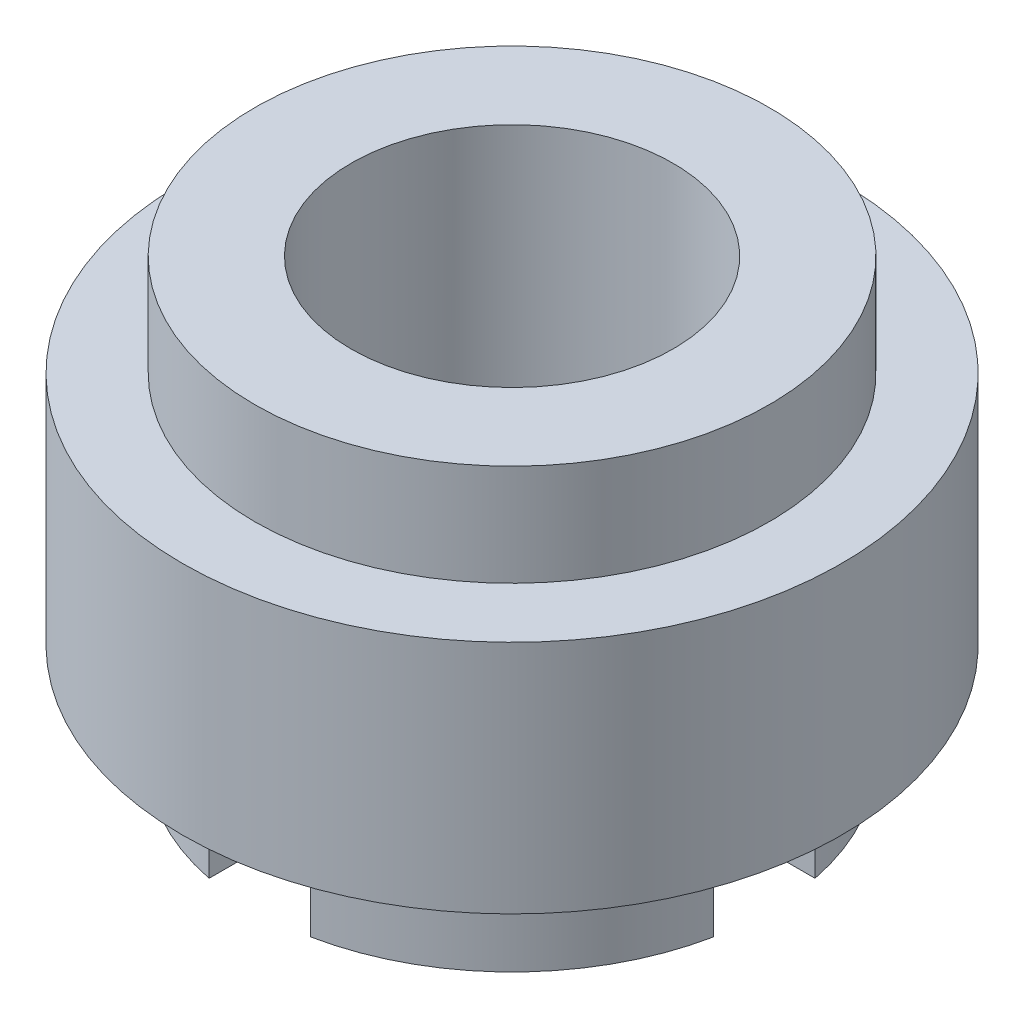
ISO-10303-21;
HEADER;
FILE_DESCRIPTION(('STEP AP214'),'2;1');
FILE_NAME('part.step','',(''),(''),'','','');
FILE_SCHEMA(('AUTOMOTIVE_DESIGN { 1 0 10303 214 1 1 1 1 }'));
ENDSEC;
DATA;
#1=APPLICATION_CONTEXT('core data for automotive mechanical design processes');
#2=APPLICATION_PROTOCOL_DEFINITION('international standard','automotive_design',2000,#1);
#3=PRODUCT_CONTEXT('',#1,'mechanical');
#4=PRODUCT('Part','Part','',(#3));
#5=PRODUCT_RELATED_PRODUCT_CATEGORY('part','',(#4));
#6=PRODUCT_DEFINITION_FORMATION('','',#4);
#7=PRODUCT_DEFINITION_CONTEXT('part definition',#1,'design');
#8=PRODUCT_DEFINITION('design','',#6,#7);
#9=PRODUCT_DEFINITION_SHAPE('','',#8);
#10=(LENGTH_UNIT() NAMED_UNIT(*) SI_UNIT(.MILLI.,.METRE.));
#11=(NAMED_UNIT(*) PLANE_ANGLE_UNIT() SI_UNIT($,.RADIAN.));
#12=(NAMED_UNIT(*) SI_UNIT($,.STERADIAN.) SOLID_ANGLE_UNIT());
#13=UNCERTAINTY_MEASURE_WITH_UNIT(LENGTH_MEASURE(1.E-05),#10,'distance_accuracy_value','');
#14=(GEOMETRIC_REPRESENTATION_CONTEXT(3) GLOBAL_UNCERTAINTY_ASSIGNED_CONTEXT((#13)) GLOBAL_UNIT_ASSIGNED_CONTEXT((#10,
#11,#12)) REPRESENTATION_CONTEXT('',''));
#15=CARTESIAN_POINT('',(0.,0.,0.));
#16=DIRECTION('',(0.,0.,1.));
#17=DIRECTION('',(1.,0.,0.));
#18=AXIS2_PLACEMENT_3D('',#15,#16,#17);
#19=CARTESIAN_POINT('',(0.,-2.,0.));
#20=DIRECTION('',(0.,1.,0.));
#21=DIRECTION('',(0.,0.,1.));
#22=AXIS2_PLACEMENT_3D('',#19,#20,#21);
#23=CYLINDRICAL_SURFACE('',#22,5.075);
#24=DIRECTION('',(0.,1.,0.));
#25=VECTOR('',#24,1.);
#26=CARTESIAN_POINT('',(-4.9755024871866,-2.,-1.));
#27=LINE('',#26,#25);
#28=CARTESIAN_POINT('',(-4.9755024871866,0.,-1.));
#29=VERTEX_POINT('',#28);
#30=CARTESIAN_POINT('',(-4.9755024871866,-2.,-1.));
#31=VERTEX_POINT('',#30);
#32=EDGE_CURVE('E217',#29,#31,#27,.F.);
#33=ORIENTED_EDGE('',*,*,#32,.F.);
#34=CARTESIAN_POINT('',(0.,0.,0.));
#35=DIRECTION('',(0.,1.,0.));
#36=DIRECTION('',(0.,0.,1.));
#37=AXIS2_PLACEMENT_3D('',#34,#35,#36);
#38=CIRCLE('',#37,5.075);
#39=CARTESIAN_POINT('',(-1.,0.,-4.9755024871866));
#40=VERTEX_POINT('',#39);
#41=EDGE_CURVE('E173',#29,#40,#38,.F.);
#42=ORIENTED_EDGE('',*,*,#41,.T.);
#43=DIRECTION('',(0.,1.,0.));
#44=VECTOR('',#43,1.);
#45=CARTESIAN_POINT('',(-1.,-2.,-4.9755024871866));
#46=LINE('',#45,#44);
#47=CARTESIAN_POINT('',(-1.,-2.,-4.9755024871866));
#48=VERTEX_POINT('',#47);
#49=EDGE_CURVE('E238',#48,#40,#46,.T.);
#50=ORIENTED_EDGE('',*,*,#49,.F.);
#51=CARTESIAN_POINT('',(0.,-2.,0.));
#52=DIRECTION('',(0.,-1.,0.));
#53=DIRECTION('',(0.,0.,-1.));
#54=AXIS2_PLACEMENT_3D('',#51,#52,#53);
#55=CIRCLE('',#54,5.075);
#56=EDGE_CURVE('E245',#31,#48,#55,.T.);
#57=ORIENTED_EDGE('',*,*,#56,.F.);
#58=EDGE_LOOP('',(#33,#42,#50,#57));
#59=FACE_BOUND('',#58,.T.);
#60=ADVANCED_FACE('F35',(#59),#23,.T.);
#61=DIRECTION('',(0.,1.,0.));
#62=VECTOR('',#61,1.);
#63=CARTESIAN_POINT('',(4.9755024871866,-2.,-1.));
#64=LINE('',#63,#62);
#65=CARTESIAN_POINT('',(4.9755024871866,-2.,-1.));
#66=VERTEX_POINT('',#65);
#67=CARTESIAN_POINT('',(4.9755024871866,0.,-1.));
#68=VERTEX_POINT('',#67);
#69=EDGE_CURVE('E188',#66,#68,#64,.T.);
#70=ORIENTED_EDGE('',*,*,#69,.F.);
#71=CARTESIAN_POINT('',(1.,-2.,-4.9755024871866));
#72=VERTEX_POINT('',#71);
#73=EDGE_CURVE('E251',#72,#66,#55,.T.);
#74=ORIENTED_EDGE('',*,*,#73,.F.);
#75=DIRECTION('',(0.,1.,0.));
#76=VECTOR('',#75,1.);
#77=CARTESIAN_POINT('',(1.,-2.,-4.9755024871866));
#78=LINE('',#77,#76);
#79=CARTESIAN_POINT('',(1.,0.,-4.9755024871866));
#80=VERTEX_POINT('',#79);
#81=EDGE_CURVE('E190',#80,#72,#78,.F.);
#82=ORIENTED_EDGE('',*,*,#81,.F.);
#83=EDGE_CURVE('E176',#80,#68,#38,.F.);
#84=ORIENTED_EDGE('',*,*,#83,.T.);
#85=EDGE_LOOP('',(#70,#74,#82,#84));
#86=FACE_BOUND('',#85,.T.);
#87=ADVANCED_FACE('F186',(#86),#23,.T.);
#88=CARTESIAN_POINT('',(0.,-2.,0.));
#89=DIRECTION('',(0.,-1.,0.));
#90=DIRECTION('',(0.,0.,-1.));
#91=AXIS2_PLACEMENT_3D('',#88,#89,#90);
#92=PLANE('',#91);
#93=CARTESIAN_POINT('',(0.,-2.,0.));
#94=DIRECTION('',(0.,1.,0.));
#95=DIRECTION('',(0.,0.,1.));
#96=AXIS2_PLACEMENT_3D('',#93,#94,#95);
#97=CIRCLE('',#96,3.175);
#98=CARTESIAN_POINT('',(-1.,-2.,-3.01340753964677));
#99=VERTEX_POINT('',#98);
#100=CARTESIAN_POINT('',(-3.01340753964677,-2.,-1.));
#101=VERTEX_POINT('',#100);
#102=EDGE_CURVE('E247',#99,#101,#97,.T.);
#103=ORIENTED_EDGE('',*,*,#102,.T.);
#104=DIRECTION('',(1.,0.,0.));
#105=VECTOR('',#104,1.);
#106=CARTESIAN_POINT('',(-6.5,-2.,-1.));
#107=LINE('',#106,#105);
#108=EDGE_CURVE('E205',#31,#101,#107,.T.);
#109=ORIENTED_EDGE('',*,*,#108,.F.);
#110=ORIENTED_EDGE('',*,*,#56,.T.);
#111=DIRECTION('',(0.,0.,-1.));
#112=VECTOR('',#111,1.);
#113=CARTESIAN_POINT('',(-1.,-2.,6.5));
#114=LINE('',#113,#112);
#115=EDGE_CURVE('E225',#99,#48,#114,.T.);
#116=ORIENTED_EDGE('',*,*,#115,.F.);
#117=EDGE_LOOP('',(#103,#109,#110,#116));
#118=FACE_BOUND('',#117,.T.);
#119=ADVANCED_FACE('F285',(#118),#92,.T.);
#120=ORIENTED_EDGE('',*,*,#73,.T.);
#121=CARTESIAN_POINT('',(3.01340753964677,-2.,-1.));
#122=VERTEX_POINT('',#121);
#123=EDGE_CURVE('E345',#122,#66,#107,.T.);
#124=ORIENTED_EDGE('',*,*,#123,.F.);
#125=CARTESIAN_POINT('',(1.,-2.,-3.01340753964677));
#126=VERTEX_POINT('',#125);
#127=EDGE_CURVE('E246',#122,#126,#97,.T.);
#128=ORIENTED_EDGE('',*,*,#127,.T.);
#129=DIRECTION('',(0.,0.,-1.));
#130=VECTOR('',#129,1.);
#131=CARTESIAN_POINT('',(1.,-2.,6.5));
#132=LINE('',#131,#130);
#133=EDGE_CURVE('E221',#126,#72,#132,.T.);
#134=ORIENTED_EDGE('',*,*,#133,.T.);
#135=EDGE_LOOP('',(#120,#124,#128,#134));
#136=FACE_BOUND('',#135,.T.);
#137=ADVANCED_FACE('F278',(#136),#92,.T.);
#138=CARTESIAN_POINT('',(0.,-2.,0.));
#139=DIRECTION('',(0.,1.,0.));
#140=DIRECTION('',(0.,0.,1.));
#141=AXIS2_PLACEMENT_3D('',#138,#139,#140);
#142=CYLINDRICAL_SURFACE('',#141,3.175);
#143=CARTESIAN_POINT('',(0.,6.64,0.));
#144=DIRECTION('',(0.,1.,0.));
#145=DIRECTION('',(0.,0.,1.));
#146=AXIS2_PLACEMENT_3D('',#143,#144,#145);
#147=CIRCLE('',#146,3.175);
#148=CARTESIAN_POINT('',(0.,6.64,3.175));
#149=VERTEX_POINT('',#148);
#150=EDGE_CURVE('E241',#149,#149,#147,.T.);
#151=ORIENTED_EDGE('',*,*,#150,.T.);
#152=EDGE_LOOP('',(#151));
#153=FACE_BOUND('',#152,.T.);
#154=DIRECTION('',(0.,1.,0.));
#155=VECTOR('',#154,1.);
#156=CARTESIAN_POINT('',(-3.01340753964677,-2.,-1.));
#157=LINE('',#156,#155);
#158=CARTESIAN_POINT('',(-3.01340753964677,0.,-1.));
#159=VERTEX_POINT('',#158);
#160=EDGE_CURVE('E157',#101,#159,#157,.T.);
#161=ORIENTED_EDGE('',*,*,#160,.F.);
#162=ORIENTED_EDGE('',*,*,#102,.F.);
#163=DIRECTION('',(0.,1.,0.));
#164=VECTOR('',#163,1.);
#165=CARTESIAN_POINT('',(-1.,-2.,-3.01340753964677));
#166=LINE('',#165,#164);
#167=CARTESIAN_POINT('',(-1.,0.,-3.01340753964677));
#168=VERTEX_POINT('',#167);
#169=EDGE_CURVE('E334',#168,#99,#166,.F.);
#170=ORIENTED_EDGE('',*,*,#169,.F.);
#171=CARTESIAN_POINT('',(0.,0.,0.));
#172=DIRECTION('',(0.,-1.,0.));
#173=DIRECTION('',(1.,0.,0.));
#174=AXIS2_PLACEMENT_3D('',#171,#172,#173);
#175=CIRCLE('',#174,3.175);
#176=CARTESIAN_POINT('',(1.,0.,-3.01340753964677));
#177=VERTEX_POINT('',#176);
#178=EDGE_CURVE('E177',#177,#168,#175,.F.);
#179=ORIENTED_EDGE('',*,*,#178,.F.);
#180=DIRECTION('',(0.,1.,0.));
#181=VECTOR('',#180,1.);
#182=CARTESIAN_POINT('',(1.,-2.,-3.01340753964677));
#183=LINE('',#182,#181);
#184=EDGE_CURVE('E172',#126,#177,#183,.T.);
#185=ORIENTED_EDGE('',*,*,#184,.F.);
#186=ORIENTED_EDGE('',*,*,#127,.F.);
#187=DIRECTION('',(0.,1.,0.));
#188=VECTOR('',#187,1.);
#189=CARTESIAN_POINT('',(3.01340753964677,-2.,-1.));
#190=LINE('',#189,#188);
#191=CARTESIAN_POINT('',(3.01340753964677,0.,-1.));
#192=VERTEX_POINT('',#191);
#193=EDGE_CURVE('E214',#192,#122,#190,.F.);
#194=ORIENTED_EDGE('',*,*,#193,.F.);
#195=CARTESIAN_POINT('',(0.,0.,0.));
#196=DIRECTION('',(0.,-1.,0.));
#197=DIRECTION('',(0.,0.,-1.));
#198=AXIS2_PLACEMENT_3D('',#195,#196,#197);
#199=CIRCLE('',#198,3.175);
#200=CARTESIAN_POINT('',(3.01340753964677,0.,1.));
#201=VERTEX_POINT('',#200);
#202=EDGE_CURVE('E198',#201,#192,#199,.F.);
#203=ORIENTED_EDGE('',*,*,#202,.F.);
#204=DIRECTION('',(0.,1.,0.));
#205=VECTOR('',#204,1.);
#206=CARTESIAN_POINT('',(3.01340753964677,-2.,1.));
#207=LINE('',#206,#205);
#208=CARTESIAN_POINT('',(3.01340753964677,-2.,1.));
#209=VERTEX_POINT('',#208);
#210=EDGE_CURVE('E208',#201,#209,#207,.F.);
#211=ORIENTED_EDGE('',*,*,#210,.T.);
#212=CARTESIAN_POINT('',(1.,-2.,3.01340753964677));
#213=VERTEX_POINT('',#212);
#214=EDGE_CURVE('E242',#213,#209,#97,.T.);
#215=ORIENTED_EDGE('',*,*,#214,.F.);
#216=DIRECTION('',(0.,1.,0.));
#217=VECTOR('',#216,1.);
#218=CARTESIAN_POINT('',(1.,-2.,3.01340753964677));
#219=LINE('',#218,#217);
#220=CARTESIAN_POINT('',(1.,0.,3.01340753964677));
#221=VERTEX_POINT('',#220);
#222=EDGE_CURVE('E331',#221,#213,#219,.F.);
#223=ORIENTED_EDGE('',*,*,#222,.F.);
#224=CARTESIAN_POINT('',(-1.,0.,3.01340753964677));
#225=VERTEX_POINT('',#224);
#226=EDGE_CURVE('E43',#225,#221,#175,.F.);
#227=ORIENTED_EDGE('',*,*,#226,.F.);
#228=DIRECTION('',(0.,1.,0.));
#229=VECTOR('',#228,1.);
#230=CARTESIAN_POINT('',(-1.,-2.,3.01340753964677));
#231=LINE('',#230,#229);
#232=CARTESIAN_POINT('',(-1.,-2.,3.01340753964677));
#233=VERTEX_POINT('',#232);
#234=EDGE_CURVE('E11',#233,#225,#231,.T.);
#235=ORIENTED_EDGE('',*,*,#234,.F.);
#236=CARTESIAN_POINT('',(-3.01340753964677,-2.,1.));
#237=VERTEX_POINT('',#236);
#238=EDGE_CURVE('E250',#237,#233,#97,.T.);
#239=ORIENTED_EDGE('',*,*,#238,.F.);
#240=DIRECTION('',(0.,1.,0.));
#241=VECTOR('',#240,1.);
#242=CARTESIAN_POINT('',(-3.01340753964677,-2.,1.));
#243=LINE('',#242,#241);
#244=CARTESIAN_POINT('',(-3.01340753964677,0.,1.));
#245=VERTEX_POINT('',#244);
#246=EDGE_CURVE('E206',#237,#245,#243,.T.);
#247=ORIENTED_EDGE('',*,*,#246,.T.);
#248=EDGE_CURVE('E166',#159,#245,#199,.F.);
#249=ORIENTED_EDGE('',*,*,#248,.F.);
#250=EDGE_LOOP('',(#161,#162,#170,#179,#185,#186,#194,#203,#211,#215,#223,#227,#235,#239,#247,#249));
#251=FACE_BOUND('',#250,.T.);
#252=ADVANCED_FACE('F290',(#153,#251),#142,.F.);
#253=CARTESIAN_POINT('',(-1.,0.,4.9755024871866));
#254=VERTEX_POINT('',#253);
#255=CARTESIAN_POINT('',(-4.9755024871866,0.,1.));
#256=VERTEX_POINT('',#255);
#257=EDGE_CURVE('E164',#254,#256,#38,.F.);
#258=ORIENTED_EDGE('',*,*,#257,.T.);
#259=DIRECTION('',(0.,1.,0.));
#260=VECTOR('',#259,1.);
#261=CARTESIAN_POINT('',(-4.9755024871866,-2.,1.));
#262=LINE('',#261,#260);
#263=CARTESIAN_POINT('',(-4.9755024871866,-2.,1.));
#264=VERTEX_POINT('',#263);
#265=EDGE_CURVE('E146',#256,#264,#262,.F.);
#266=ORIENTED_EDGE('',*,*,#265,.T.);
#267=CARTESIAN_POINT('',(-1.,-2.,4.9755024871866));
#268=VERTEX_POINT('',#267);
#269=EDGE_CURVE('E255',#268,#264,#55,.T.);
#270=ORIENTED_EDGE('',*,*,#269,.F.);
#271=DIRECTION('',(0.,1.,0.));
#272=VECTOR('',#271,1.);
#273=CARTESIAN_POINT('',(-1.,-2.,4.9755024871866));
#274=LINE('',#273,#272);
#275=EDGE_CURVE('E171',#254,#268,#274,.F.);
#276=ORIENTED_EDGE('',*,*,#275,.F.);
#277=EDGE_LOOP('',(#258,#266,#270,#276));
#278=FACE_BOUND('',#277,.T.);
#279=ADVANCED_FACE('F170',(#278),#23,.T.);
#280=CARTESIAN_POINT('',(4.9755024871866,-2.,1.));
#281=VERTEX_POINT('',#280);
#282=CARTESIAN_POINT('',(1.,-2.,4.9755024871866));
#283=VERTEX_POINT('',#282);
#284=EDGE_CURVE('E254',#281,#283,#55,.T.);
#285=ORIENTED_EDGE('',*,*,#284,.F.);
#286=DIRECTION('',(0.,1.,0.));
#287=VECTOR('',#286,1.);
#288=CARTESIAN_POINT('',(4.9755024871866,-2.,1.));
#289=LINE('',#288,#287);
#290=CARTESIAN_POINT('',(4.9755024871866,0.,1.));
#291=VERTEX_POINT('',#290);
#292=EDGE_CURVE('E158',#281,#291,#289,.T.);
#293=ORIENTED_EDGE('',*,*,#292,.T.);
#294=CARTESIAN_POINT('',(1.,0.,4.9755024871866));
#295=VERTEX_POINT('',#294);
#296=EDGE_CURVE('E175',#291,#295,#38,.F.);
#297=ORIENTED_EDGE('',*,*,#296,.T.);
#298=DIRECTION('',(0.,1.,0.));
#299=VECTOR('',#298,1.);
#300=CARTESIAN_POINT('',(1.,-2.,4.9755024871866));
#301=LINE('',#300,#299);
#302=EDGE_CURVE('E234',#283,#295,#301,.T.);
#303=ORIENTED_EDGE('',*,*,#302,.F.);
#304=EDGE_LOOP('',(#285,#293,#297,#303));
#305=FACE_BOUND('',#304,.T.);
#306=ADVANCED_FACE('F286',(#305),#23,.T.);
#307=DIRECTION('',(1.,0.,0.));
#308=VECTOR('',#307,1.);
#309=CARTESIAN_POINT('',(-6.5,-2.,1.));
#310=LINE('',#309,#308);
#311=EDGE_CURVE('E152',#264,#237,#310,.T.);
#312=ORIENTED_EDGE('',*,*,#311,.T.);
#313=ORIENTED_EDGE('',*,*,#238,.T.);
#314=EDGE_CURVE('E228',#268,#233,#114,.T.);
#315=ORIENTED_EDGE('',*,*,#314,.F.);
#316=ORIENTED_EDGE('',*,*,#269,.T.);
#317=EDGE_LOOP('',(#312,#313,#315,#316));
#318=FACE_BOUND('',#317,.T.);
#319=ADVANCED_FACE('F275',(#318),#92,.T.);
#320=EDGE_CURVE('E167',#209,#281,#310,.T.);
#321=ORIENTED_EDGE('',*,*,#320,.T.);
#322=ORIENTED_EDGE('',*,*,#284,.T.);
#323=EDGE_CURVE('E224',#283,#213,#132,.T.);
#324=ORIENTED_EDGE('',*,*,#323,.T.);
#325=ORIENTED_EDGE('',*,*,#214,.T.);
#326=EDGE_LOOP('',(#321,#322,#324,#325));
#327=FACE_BOUND('',#326,.T.);
#328=ADVANCED_FACE('F268',(#327),#92,.T.);
#329=CARTESIAN_POINT('',(0.,0.,0.));
#330=DIRECTION('',(0.,1.,0.));
#331=DIRECTION('',(0.,0.,1.));
#332=AXIS2_PLACEMENT_3D('',#329,#330,#331);
#333=PLANE('',#332);
#334=ORIENTED_EDGE('',*,*,#41,.F.);
#335=DIRECTION('',(1.,0.,0.));
#336=VECTOR('',#335,1.);
#337=CARTESIAN_POINT('',(-6.5,0.,-1.));
#338=LINE('',#337,#336);
#339=EDGE_CURVE('E50',#29,#159,#338,.T.);
#340=ORIENTED_EDGE('',*,*,#339,.T.);
#341=ORIENTED_EDGE('',*,*,#248,.T.);
#342=DIRECTION('',(1.,0.,0.));
#343=VECTOR('',#342,1.);
#344=CARTESIAN_POINT('',(-6.5,0.,1.));
#345=LINE('',#344,#343);
#346=EDGE_CURVE('E149',#256,#245,#345,.T.);
#347=ORIENTED_EDGE('',*,*,#346,.F.);
#348=ORIENTED_EDGE('',*,*,#257,.F.);
#349=DIRECTION('',(0.,0.,-1.));
#350=VECTOR('',#349,1.);
#351=CARTESIAN_POINT('',(-1.,0.,6.5));
#352=LINE('',#351,#350);
#353=EDGE_CURVE('E232',#254,#225,#352,.T.);
#354=ORIENTED_EDGE('',*,*,#353,.T.);
#355=ORIENTED_EDGE('',*,*,#226,.T.);
#356=DIRECTION('',(0.,0.,-1.));
#357=VECTOR('',#356,1.);
#358=CARTESIAN_POINT('',(1.,0.,6.5));
#359=LINE('',#358,#357);
#360=EDGE_CURVE('E220',#295,#221,#359,.T.);
#361=ORIENTED_EDGE('',*,*,#360,.F.);
#362=ORIENTED_EDGE('',*,*,#296,.F.);
#363=EDGE_CURVE('E57',#201,#291,#345,.T.);
#364=ORIENTED_EDGE('',*,*,#363,.F.);
#365=ORIENTED_EDGE('',*,*,#202,.T.);
#366=EDGE_CURVE('E196',#192,#68,#338,.T.);
#367=ORIENTED_EDGE('',*,*,#366,.T.);
#368=ORIENTED_EDGE('',*,*,#83,.F.);
#369=EDGE_CURVE('E193',#177,#80,#359,.T.);
#370=ORIENTED_EDGE('',*,*,#369,.F.);
#371=ORIENTED_EDGE('',*,*,#178,.T.);
#372=EDGE_CURVE('E229',#168,#40,#352,.T.);
#373=ORIENTED_EDGE('',*,*,#372,.T.);
#374=EDGE_LOOP('',(#334,#340,#341,#347,#348,#354,#355,#361,#362,#364,#365,#367,#368,#370,#371,#373));
#375=FACE_BOUND('',#374,.T.);
#376=CARTESIAN_POINT('',(0.,0.,0.));
#377=DIRECTION('',(0.,1.,0.));
#378=DIRECTION('',(0.,0.,1.));
#379=AXIS2_PLACEMENT_3D('',#376,#377,#378);
#380=CIRCLE('',#379,6.5);
#381=CARTESIAN_POINT('',(0.,0.,6.5));
#382=VERTEX_POINT('',#381);
#383=EDGE_CURVE('E259',#382,#382,#380,.T.);
#384=ORIENTED_EDGE('',*,*,#383,.F.);
#385=EDGE_LOOP('',(#384));
#386=FACE_BOUND('',#385,.T.);
#387=ADVANCED_FACE('F161',(#375,#386),#333,.F.);
#388=CARTESIAN_POINT('',(0.,4.64,0.));
#389=DIRECTION('',(0.,1.,0.));
#390=DIRECTION('',(0.,0.,1.));
#391=AXIS2_PLACEMENT_3D('',#388,#389,#390);
#392=PLANE('',#391);
#393=CARTESIAN_POINT('',(0.,4.64,0.));
#394=DIRECTION('',(0.,1.,0.));
#395=DIRECTION('',(0.,0.,1.));
#396=AXIS2_PLACEMENT_3D('',#393,#394,#395);
#397=CIRCLE('',#396,6.5);
#398=CARTESIAN_POINT('',(0.,4.64,6.5));
#399=VERTEX_POINT('',#398);
#400=EDGE_CURVE('E180',#399,#399,#397,.T.);
#401=ORIENTED_EDGE('',*,*,#400,.T.);
#402=EDGE_LOOP('',(#401));
#403=FACE_BOUND('',#402,.T.);
#404=CARTESIAN_POINT('',(0.,4.64,0.));
#405=DIRECTION('',(0.,1.,0.));
#406=DIRECTION('',(0.,0.,1.));
#407=AXIS2_PLACEMENT_3D('',#404,#405,#406);
#408=CIRCLE('',#407,5.075);
#409=CARTESIAN_POINT('',(0.,4.64,5.075));
#410=VERTEX_POINT('',#409);
#411=EDGE_CURVE('E253',#410,#410,#408,.T.);
#412=ORIENTED_EDGE('',*,*,#411,.F.);
#413=EDGE_LOOP('',(#412));
#414=FACE_BOUND('',#413,.T.);
#415=ADVANCED_FACE('F267',(#403,#414),#392,.T.);
#416=CARTESIAN_POINT('',(0.,4.64,0.));
#417=DIRECTION('',(0.,-1.,0.));
#418=DIRECTION('',(0.,0.,-1.));
#419=AXIS2_PLACEMENT_3D('',#416,#417,#418);
#420=CYLINDRICAL_SURFACE('',#419,6.5);
#421=ORIENTED_EDGE('',*,*,#400,.F.);
#422=EDGE_LOOP('',(#421));
#423=FACE_BOUND('',#422,.T.);
#424=ORIENTED_EDGE('',*,*,#383,.T.);
#425=EDGE_LOOP('',(#424));
#426=FACE_BOUND('',#425,.T.);
#427=ADVANCED_FACE('F37',(#423,#426),#420,.T.);
#428=CARTESIAN_POINT('',(0.,6.64,0.));
#429=DIRECTION('',(0.,-1.,0.));
#430=DIRECTION('',(0.,0.,-1.));
#431=AXIS2_PLACEMENT_3D('',#428,#429,#430);
#432=CYLINDRICAL_SURFACE('',#431,5.075);
#433=CARTESIAN_POINT('',(0.,6.64,0.));
#434=DIRECTION('',(0.,1.,0.));
#435=DIRECTION('',(0.,0.,1.));
#436=AXIS2_PLACEMENT_3D('',#433,#434,#435);
#437=CIRCLE('',#436,5.075);
#438=CARTESIAN_POINT('',(0.,6.64,5.075));
#439=VERTEX_POINT('',#438);
#440=EDGE_CURVE('E256',#439,#439,#437,.T.);
#441=ORIENTED_EDGE('',*,*,#440,.F.);
#442=EDGE_LOOP('',(#441));
#443=FACE_BOUND('',#442,.T.);
#444=ORIENTED_EDGE('',*,*,#411,.T.);
#445=EDGE_LOOP('',(#444));
#446=FACE_BOUND('',#445,.T.);
#447=ADVANCED_FACE('F377',(#443,#446),#432,.T.);
#448=CARTESIAN_POINT('',(0.,6.64,0.));
#449=DIRECTION('',(0.,1.,0.));
#450=DIRECTION('',(0.,0.,1.));
#451=AXIS2_PLACEMENT_3D('',#448,#449,#450);
#452=PLANE('',#451);
#453=ORIENTED_EDGE('',*,*,#150,.F.);
#454=EDGE_LOOP('',(#453));
#455=FACE_BOUND('',#454,.T.);
#456=ORIENTED_EDGE('',*,*,#440,.T.);
#457=EDGE_LOOP('',(#456));
#458=FACE_BOUND('',#457,.T.);
#459=ADVANCED_FACE('F372',(#455,#458),#452,.T.);
#460=CARTESIAN_POINT('',(1.,-2.,6.5));
#461=DIRECTION('',(-1.,0.,0.));
#462=DIRECTION('',(0.,0.,1.));
#463=AXIS2_PLACEMENT_3D('',#460,#461,#462);
#464=PLANE('',#463);
#465=ORIENTED_EDGE('',*,*,#81,.T.);
#466=ORIENTED_EDGE('',*,*,#133,.F.);
#467=ORIENTED_EDGE('',*,*,#184,.T.);
#468=ORIENTED_EDGE('',*,*,#369,.T.);
#469=EDGE_LOOP('',(#465,#466,#467,#468));
#470=FACE_BOUND('',#469,.T.);
#471=ADVANCED_FACE('F343',(#470),#464,.T.);
#472=CARTESIAN_POINT('',(-1.,0.,6.5));
#473=DIRECTION('',(1.,0.,0.));
#474=DIRECTION('',(0.,1.,0.));
#475=AXIS2_PLACEMENT_3D('',#472,#473,#474);
#476=PLANE('',#475);
#477=ORIENTED_EDGE('',*,*,#49,.T.);
#478=ORIENTED_EDGE('',*,*,#372,.F.);
#479=ORIENTED_EDGE('',*,*,#169,.T.);
#480=ORIENTED_EDGE('',*,*,#115,.T.);
#481=EDGE_LOOP('',(#477,#478,#479,#480));
#482=FACE_BOUND('',#481,.T.);
#483=ADVANCED_FACE('F304',(#482),#476,.T.);
#484=ORIENTED_EDGE('',*,*,#275,.T.);
#485=ORIENTED_EDGE('',*,*,#314,.T.);
#486=ORIENTED_EDGE('',*,*,#234,.T.);
#487=ORIENTED_EDGE('',*,*,#353,.F.);
#488=EDGE_LOOP('',(#484,#485,#486,#487));
#489=FACE_BOUND('',#488,.T.);
#490=ADVANCED_FACE('F326',(#489),#476,.T.);
#491=ORIENTED_EDGE('',*,*,#302,.T.);
#492=ORIENTED_EDGE('',*,*,#360,.T.);
#493=ORIENTED_EDGE('',*,*,#222,.T.);
#494=ORIENTED_EDGE('',*,*,#323,.F.);
#495=EDGE_LOOP('',(#491,#492,#493,#494));
#496=FACE_BOUND('',#495,.T.);
#497=ADVANCED_FACE('F364',(#496),#464,.T.);
#498=CARTESIAN_POINT('',(-6.5,-1.,1.));
#499=DIRECTION('',(0.,0.,1.));
#500=DIRECTION('',(0.,-1.,0.));
#501=AXIS2_PLACEMENT_3D('',#498,#499,#500);
#502=PLANE('',#501);
#503=ORIENTED_EDGE('',*,*,#320,.F.);
#504=ORIENTED_EDGE('',*,*,#210,.F.);
#505=ORIENTED_EDGE('',*,*,#363,.T.);
#506=ORIENTED_EDGE('',*,*,#292,.F.);
#507=EDGE_LOOP('',(#503,#504,#505,#506));
#508=FACE_BOUND('',#507,.T.);
#509=ADVANCED_FACE('F363',(#508),#502,.F.);
#510=CARTESIAN_POINT('',(-6.5,-1.,-1.));
#511=DIRECTION('',(0.,0.,1.));
#512=DIRECTION('',(1.,0.,0.));
#513=AXIS2_PLACEMENT_3D('',#510,#511,#512);
#514=PLANE('',#513);
#515=ORIENTED_EDGE('',*,*,#69,.T.);
#516=ORIENTED_EDGE('',*,*,#366,.F.);
#517=ORIENTED_EDGE('',*,*,#193,.T.);
#518=ORIENTED_EDGE('',*,*,#123,.T.);
#519=EDGE_LOOP('',(#515,#516,#517,#518));
#520=FACE_BOUND('',#519,.T.);
#521=ADVANCED_FACE('F356',(#520),#514,.T.);
#522=ORIENTED_EDGE('',*,*,#32,.T.);
#523=ORIENTED_EDGE('',*,*,#108,.T.);
#524=ORIENTED_EDGE('',*,*,#160,.T.);
#525=ORIENTED_EDGE('',*,*,#339,.F.);
#526=EDGE_LOOP('',(#522,#523,#524,#525));
#527=FACE_BOUND('',#526,.T.);
#528=ADVANCED_FACE('F354',(#527),#514,.T.);
#529=ORIENTED_EDGE('',*,*,#346,.T.);
#530=ORIENTED_EDGE('',*,*,#246,.F.);
#531=ORIENTED_EDGE('',*,*,#311,.F.);
#532=ORIENTED_EDGE('',*,*,#265,.F.);
#533=EDGE_LOOP('',(#529,#530,#531,#532));
#534=FACE_BOUND('',#533,.T.);
#535=ADVANCED_FACE('F148',(#534),#502,.F.);
#536=CLOSED_SHELL('',(#60,#87,#119,#137,#252,#279,#306,#319,#328,#387,#415,#427,#447,#459,#471,
#483,#490,#497,#509,#521,#528,#535));
#537=MANIFOLD_SOLID_BREP('B2',#536);
#538=ADVANCED_BREP_SHAPE_REPRESENTATION('',(#18,#537),#14);
#539=SHAPE_DEFINITION_REPRESENTATION(#9,#538);
ENDSEC;
END-ISO-10303-21;
